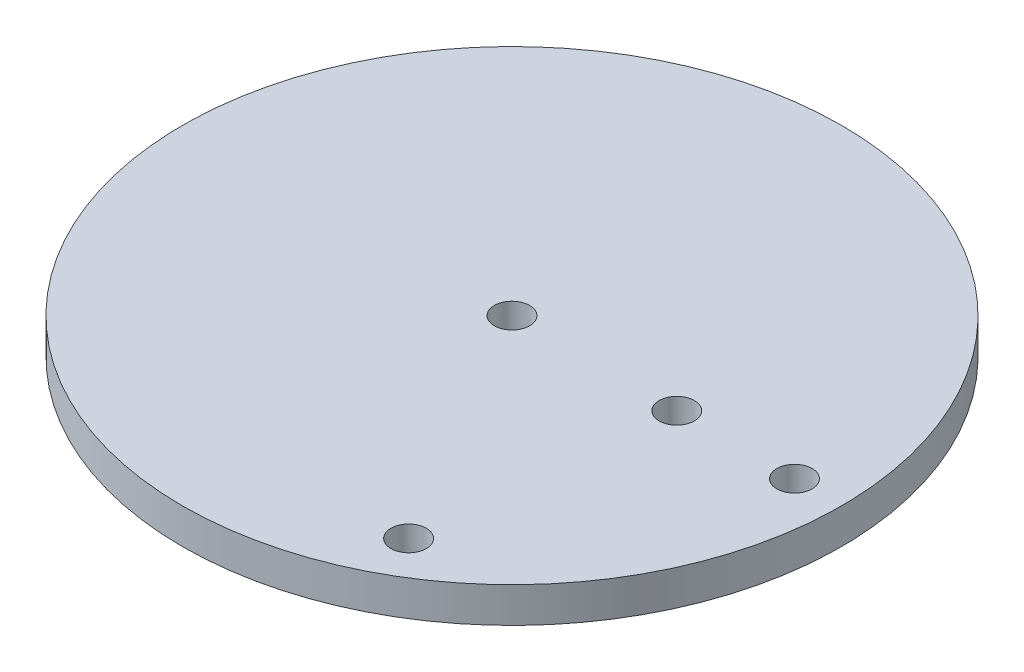
ISO-10303-21;
HEADER;
FILE_DESCRIPTION(('STEP AP214'),'2;1');
FILE_NAME('part.step','',(''),(''),'','','');
FILE_SCHEMA(('AUTOMOTIVE_DESIGN { 1 0 10303 214 1 1 1 1 }'));
ENDSEC;
DATA;
#1=APPLICATION_CONTEXT('core data for automotive mechanical design processes');
#2=APPLICATION_PROTOCOL_DEFINITION('international standard','automotive_design',2000,#1);
#3=PRODUCT_CONTEXT('',#1,'mechanical');
#4=PRODUCT('Part','Part','',(#3));
#5=PRODUCT_RELATED_PRODUCT_CATEGORY('part','',(#4));
#6=PRODUCT_DEFINITION_FORMATION('','',#4);
#7=PRODUCT_DEFINITION_CONTEXT('part definition',#1,'design');
#8=PRODUCT_DEFINITION('design','',#6,#7);
#9=PRODUCT_DEFINITION_SHAPE('','',#8);
#10=(LENGTH_UNIT() NAMED_UNIT(*) SI_UNIT(.MILLI.,.METRE.));
#11=(NAMED_UNIT(*) PLANE_ANGLE_UNIT() SI_UNIT($,.RADIAN.));
#12=(NAMED_UNIT(*) SI_UNIT($,.STERADIAN.) SOLID_ANGLE_UNIT());
#13=UNCERTAINTY_MEASURE_WITH_UNIT(LENGTH_MEASURE(1.E-05),#10,'distance_accuracy_value','');
#14=(GEOMETRIC_REPRESENTATION_CONTEXT(3) GLOBAL_UNCERTAINTY_ASSIGNED_CONTEXT((#13)) GLOBAL_UNIT_ASSIGNED_CONTEXT((#10,
#11,#12)) REPRESENTATION_CONTEXT('',''));
#15=CARTESIAN_POINT('',(0.,0.,0.));
#16=DIRECTION('',(0.,0.,1.));
#17=DIRECTION('',(1.,0.,0.));
#18=AXIS2_PLACEMENT_3D('',#15,#16,#17);
#19=CARTESIAN_POINT('',(0.,1.5,0.));
#20=DIRECTION('',(0.,1.,0.));
#21=DIRECTION('',(0.,0.,1.));
#22=AXIS2_PLACEMENT_3D('',#19,#20,#21);
#23=PLANE('',#22);
#24=CARTESIAN_POINT('',(12.,1.5,20.7846096908266));
#25=DIRECTION('',(0.,1.,0.));
#26=DIRECTION('',(0.,0.,1.));
#27=AXIS2_PLACEMENT_3D('',#24,#25,#26);
#28=CIRCLE('',#27,1.5);
#29=CARTESIAN_POINT('',(12.,1.5,22.2846096908266));
#30=VERTEX_POINT('',#29);
#31=EDGE_CURVE('E53',#30,#30,#28,.T.);
#32=ORIENTED_EDGE('',*,*,#31,.F.);
#33=EDGE_LOOP('',(#32));
#34=FACE_BOUND('',#33,.T.);
#35=CARTESIAN_POINT('',(0.,1.5,0.));
#36=DIRECTION('',(0.,1.,0.));
#37=DIRECTION('',(0.,0.,1.));
#38=AXIS2_PLACEMENT_3D('',#35,#36,#37);
#39=CIRCLE('',#38,1.5);
#40=CARTESIAN_POINT('',(0.,1.5,1.5));
#41=VERTEX_POINT('',#40);
#42=EDGE_CURVE('E42',#41,#41,#39,.T.);
#43=ORIENTED_EDGE('',*,*,#42,.F.);
#44=EDGE_LOOP('',(#43));
#45=FACE_BOUND('',#44,.T.);
#46=CARTESIAN_POINT('',(0.,1.5,0.));
#47=DIRECTION('',(0.,1.,0.));
#48=DIRECTION('',(0.,0.,1.));
#49=AXIS2_PLACEMENT_3D('',#46,#47,#48);
#50=CIRCLE('',#49,28.);
#51=CARTESIAN_POINT('',(0.,1.5,28.));
#52=VERTEX_POINT('',#51);
#53=EDGE_CURVE('E10',#52,#52,#50,.T.);
#54=ORIENTED_EDGE('',*,*,#53,.T.);
#55=EDGE_LOOP('',(#54));
#56=FACE_BOUND('',#55,.T.);
#57=CARTESIAN_POINT('',(24.,1.5,0.));
#58=DIRECTION('',(0.,1.,0.));
#59=DIRECTION('',(0.,0.,1.));
#60=AXIS2_PLACEMENT_3D('',#57,#58,#59);
#61=CIRCLE('',#60,1.5);
#62=CARTESIAN_POINT('',(24.,1.5,1.5));
#63=VERTEX_POINT('',#62);
#64=EDGE_CURVE('E47',#63,#63,#61,.T.);
#65=ORIENTED_EDGE('',*,*,#64,.F.);
#66=EDGE_LOOP('',(#65));
#67=FACE_BOUND('',#66,.T.);
#68=CARTESIAN_POINT('',(14.,1.5,0.));
#69=DIRECTION('',(0.,1.,0.));
#70=DIRECTION('',(0.,0.,1.));
#71=AXIS2_PLACEMENT_3D('',#68,#69,#70);
#72=CIRCLE('',#71,1.5);
#73=CARTESIAN_POINT('',(14.,1.5,1.5));
#74=VERTEX_POINT('',#73);
#75=EDGE_CURVE('E59',#74,#74,#72,.T.);
#76=ORIENTED_EDGE('',*,*,#75,.F.);
#77=EDGE_LOOP('',(#76));
#78=FACE_BOUND('',#77,.T.);
#79=ADVANCED_FACE('F31',(#34,#45,#56,#67,#78),#23,.T.);
#80=CARTESIAN_POINT('',(0.,-1.5,0.));
#81=DIRECTION('',(0.,1.,0.));
#82=DIRECTION('',(0.,0.,1.));
#83=AXIS2_PLACEMENT_3D('',#80,#81,#82);
#84=PLANE('',#83);
#85=CARTESIAN_POINT('',(0.,-1.5,0.));
#86=DIRECTION('',(0.,1.,0.));
#87=DIRECTION('',(0.,0.,1.));
#88=AXIS2_PLACEMENT_3D('',#85,#86,#87);
#89=CIRCLE('',#88,28.);
#90=CARTESIAN_POINT('',(0.,-1.5,28.));
#91=VERTEX_POINT('',#90);
#92=EDGE_CURVE('E35',#91,#91,#89,.T.);
#93=ORIENTED_EDGE('',*,*,#92,.F.);
#94=EDGE_LOOP('',(#93));
#95=FACE_BOUND('',#94,.T.);
#96=CARTESIAN_POINT('',(0.,-1.5,0.));
#97=DIRECTION('',(0.,1.,0.));
#98=DIRECTION('',(0.,0.,1.));
#99=AXIS2_PLACEMENT_3D('',#96,#97,#98);
#100=CIRCLE('',#99,1.5);
#101=CARTESIAN_POINT('',(0.,-1.5,1.5));
#102=VERTEX_POINT('',#101);
#103=EDGE_CURVE('E44',#102,#102,#100,.T.);
#104=ORIENTED_EDGE('',*,*,#103,.T.);
#105=EDGE_LOOP('',(#104));
#106=FACE_BOUND('',#105,.T.);
#107=CARTESIAN_POINT('',(24.,-1.5,0.));
#108=DIRECTION('',(0.,1.,0.));
#109=DIRECTION('',(0.,0.,1.));
#110=AXIS2_PLACEMENT_3D('',#107,#108,#109);
#111=CIRCLE('',#110,1.5);
#112=CARTESIAN_POINT('',(24.,-1.5,1.5));
#113=VERTEX_POINT('',#112);
#114=EDGE_CURVE('E50',#113,#113,#111,.T.);
#115=ORIENTED_EDGE('',*,*,#114,.T.);
#116=EDGE_LOOP('',(#115));
#117=FACE_BOUND('',#116,.T.);
#118=CARTESIAN_POINT('',(12.,-1.5,20.7846096908266));
#119=DIRECTION('',(0.,1.,0.));
#120=DIRECTION('',(0.,0.,1.));
#121=AXIS2_PLACEMENT_3D('',#118,#119,#120);
#122=CIRCLE('',#121,1.5);
#123=CARTESIAN_POINT('',(12.,-1.5,22.2846096908266));
#124=VERTEX_POINT('',#123);
#125=EDGE_CURVE('E56',#124,#124,#122,.T.);
#126=ORIENTED_EDGE('',*,*,#125,.T.);
#127=EDGE_LOOP('',(#126));
#128=FACE_BOUND('',#127,.T.);
#129=CARTESIAN_POINT('',(14.,-1.5,0.));
#130=DIRECTION('',(0.,1.,0.));
#131=DIRECTION('',(0.,0.,1.));
#132=AXIS2_PLACEMENT_3D('',#129,#130,#131);
#133=CIRCLE('',#132,1.5);
#134=CARTESIAN_POINT('',(14.,-1.5,1.5));
#135=VERTEX_POINT('',#134);
#136=EDGE_CURVE('E62',#135,#135,#133,.T.);
#137=ORIENTED_EDGE('',*,*,#136,.T.);
#138=EDGE_LOOP('',(#137));
#139=FACE_BOUND('',#138,.T.);
#140=ADVANCED_FACE('F72',(#95,#106,#117,#128,#139),#84,.F.);
#141=CARTESIAN_POINT('',(0.,1.5,0.));
#142=DIRECTION('',(0.,-1.,0.));
#143=DIRECTION('',(0.,0.,-1.));
#144=AXIS2_PLACEMENT_3D('',#141,#142,#143);
#145=CYLINDRICAL_SURFACE('',#144,28.);
#146=ORIENTED_EDGE('',*,*,#53,.F.);
#147=EDGE_LOOP('',(#146));
#148=FACE_BOUND('',#147,.T.);
#149=ORIENTED_EDGE('',*,*,#92,.T.);
#150=EDGE_LOOP('',(#149));
#151=FACE_BOUND('',#150,.T.);
#152=ADVANCED_FACE('F33',(#148,#151),#145,.T.);
#153=CARTESIAN_POINT('',(0.,1.5,0.));
#154=DIRECTION('',(0.,-1.,0.));
#155=DIRECTION('',(0.,0.,-1.));
#156=AXIS2_PLACEMENT_3D('',#153,#154,#155);
#157=CYLINDRICAL_SURFACE('',#156,1.5);
#158=ORIENTED_EDGE('',*,*,#42,.T.);
#159=EDGE_LOOP('',(#158));
#160=FACE_BOUND('',#159,.T.);
#161=ORIENTED_EDGE('',*,*,#103,.F.);
#162=EDGE_LOOP('',(#161));
#163=FACE_BOUND('',#162,.T.);
#164=ADVANCED_FACE('F82',(#160,#163),#157,.F.);
#165=CARTESIAN_POINT('',(24.,1.5,0.));
#166=DIRECTION('',(0.,-1.,0.));
#167=DIRECTION('',(0.,0.,-1.));
#168=AXIS2_PLACEMENT_3D('',#165,#166,#167);
#169=CYLINDRICAL_SURFACE('',#168,1.5);
#170=ORIENTED_EDGE('',*,*,#64,.T.);
#171=EDGE_LOOP('',(#170));
#172=FACE_BOUND('',#171,.T.);
#173=ORIENTED_EDGE('',*,*,#114,.F.);
#174=EDGE_LOOP('',(#173));
#175=FACE_BOUND('',#174,.T.);
#176=ADVANCED_FACE('F85',(#172,#175),#169,.F.);
#177=CARTESIAN_POINT('',(12.,1.5,20.7846096908266));
#178=DIRECTION('',(0.,-1.,0.));
#179=DIRECTION('',(0.,0.,-1.));
#180=AXIS2_PLACEMENT_3D('',#177,#178,#179);
#181=CYLINDRICAL_SURFACE('',#180,1.5);
#182=ORIENTED_EDGE('',*,*,#31,.T.);
#183=EDGE_LOOP('',(#182));
#184=FACE_BOUND('',#183,.T.);
#185=ORIENTED_EDGE('',*,*,#125,.F.);
#186=EDGE_LOOP('',(#185));
#187=FACE_BOUND('',#186,.T.);
#188=ADVANCED_FACE('F89',(#184,#187),#181,.F.);
#189=CARTESIAN_POINT('',(14.,1.5,0.));
#190=DIRECTION('',(0.,-1.,0.));
#191=DIRECTION('',(0.,0.,-1.));
#192=AXIS2_PLACEMENT_3D('',#189,#190,#191);
#193=CYLINDRICAL_SURFACE('',#192,1.5);
#194=ORIENTED_EDGE('',*,*,#75,.T.);
#195=EDGE_LOOP('',(#194));
#196=FACE_BOUND('',#195,.T.);
#197=ORIENTED_EDGE('',*,*,#136,.F.);
#198=EDGE_LOOP('',(#197));
#199=FACE_BOUND('',#198,.T.);
#200=ADVANCED_FACE('F68',(#196,#199),#193,.F.);
#201=CLOSED_SHELL('',(#79,#140,#152,#164,#176,#188,#200));
#202=MANIFOLD_SOLID_BREP('B2',#201);
#203=ADVANCED_BREP_SHAPE_REPRESENTATION('',(#18,#202),#14);
#204=SHAPE_DEFINITION_REPRESENTATION(#9,#203);
ENDSEC;
END-ISO-10303-21;
